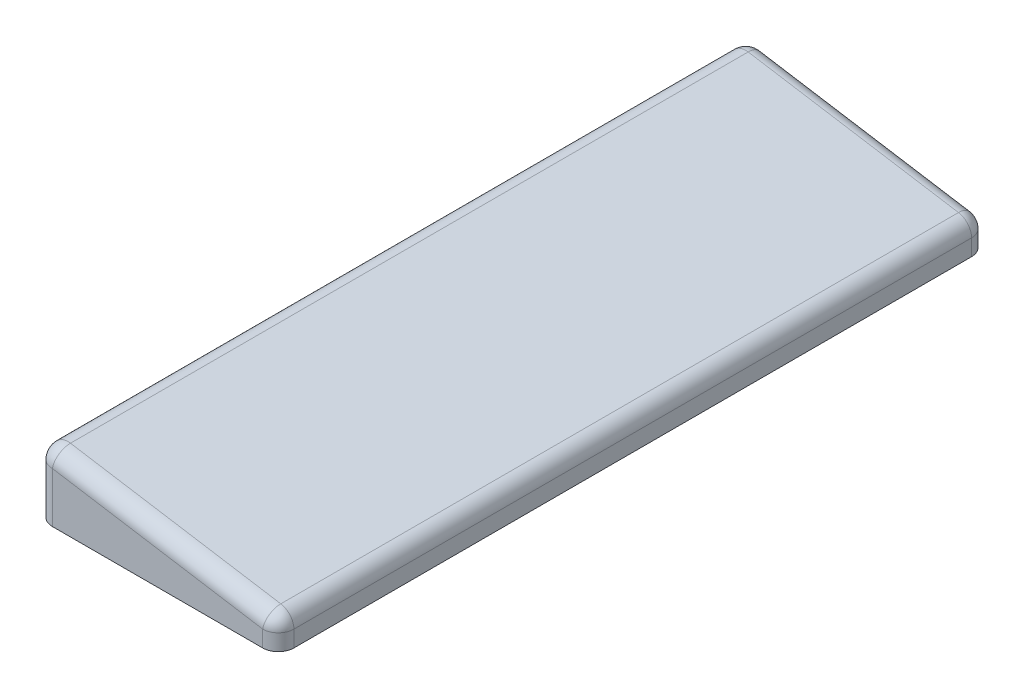
ISO-10303-21;
HEADER;
FILE_DESCRIPTION(('STEP AP214'),'2;1');
FILE_NAME('part.step','',(''),(''),'','','');
FILE_SCHEMA(('AUTOMOTIVE_DESIGN { 1 0 10303 214 1 1 1 1 }'));
ENDSEC;
DATA;
#1=APPLICATION_CONTEXT('core data for automotive mechanical design processes');
#2=APPLICATION_PROTOCOL_DEFINITION('international standard','automotive_design',2000,#1);
#3=PRODUCT_CONTEXT('',#1,'mechanical');
#4=PRODUCT('Part','Part','',(#3));
#5=PRODUCT_RELATED_PRODUCT_CATEGORY('part','',(#4));
#6=PRODUCT_DEFINITION_FORMATION('','',#4);
#7=PRODUCT_DEFINITION_CONTEXT('part definition',#1,'design');
#8=PRODUCT_DEFINITION('design','',#6,#7);
#9=PRODUCT_DEFINITION_SHAPE('','',#8);
#10=(LENGTH_UNIT() NAMED_UNIT(*) SI_UNIT(.MILLI.,.METRE.));
#11=(NAMED_UNIT(*) PLANE_ANGLE_UNIT() SI_UNIT($,.RADIAN.));
#12=(NAMED_UNIT(*) SI_UNIT($,.STERADIAN.) SOLID_ANGLE_UNIT());
#13=UNCERTAINTY_MEASURE_WITH_UNIT(LENGTH_MEASURE(1.E-05),#10,'distance_accuracy_value','');
#14=(GEOMETRIC_REPRESENTATION_CONTEXT(3) GLOBAL_UNCERTAINTY_ASSIGNED_CONTEXT((#13)) GLOBAL_UNIT_ASSIGNED_CONTEXT((#10,
#11,#12)) REPRESENTATION_CONTEXT('',''));
#15=CARTESIAN_POINT('',(0.,0.,0.));
#16=DIRECTION('',(0.,0.,1.));
#17=DIRECTION('',(1.,0.,0.));
#18=AXIS2_PLACEMENT_3D('',#15,#16,#17);
#19=CARTESIAN_POINT('',(0.,0.,-455.));
#20=DIRECTION('',(-1.,0.,0.));
#21=DIRECTION('',(0.,0.,1.));
#22=AXIS2_PLACEMENT_3D('',#19,#20,#21);
#23=PLANE('',#22);
#24=DIRECTION('',(0.,0.,1.));
#25=VECTOR('',#24,1.);
#26=CARTESIAN_POINT('',(0.,32.2578590528338,-455.));
#27=LINE('',#26,#25);
#28=CARTESIAN_POINT('',(0.,32.2578590528338,-10.));
#29=VERTEX_POINT('',#28);
#30=CARTESIAN_POINT('',(0.,32.2578590528338,-445.));
#31=VERTEX_POINT('',#30);
#32=EDGE_CURVE('E202',#29,#31,#27,.F.);
#33=ORIENTED_EDGE('',*,*,#32,.T.);
#34=DIRECTION('',(0.,-1.,0.));
#35=VECTOR('',#34,1.);
#36=CARTESIAN_POINT('',(0.,0.,-445.));
#37=LINE('',#36,#35);
#38=CARTESIAN_POINT('',(0.,0.,-445.));
#39=VERTEX_POINT('',#38);
#40=EDGE_CURVE('E180',#31,#39,#37,.T.);
#41=ORIENTED_EDGE('',*,*,#40,.T.);
#42=DIRECTION('',(0.,0.,1.));
#43=VECTOR('',#42,1.);
#44=CARTESIAN_POINT('',(0.,0.,-455.));
#45=LINE('',#44,#43);
#46=CARTESIAN_POINT('',(0.,0.,-10.0000000000001));
#47=VERTEX_POINT('',#46);
#48=EDGE_CURVE('E201',#39,#47,#45,.T.);
#49=ORIENTED_EDGE('',*,*,#48,.T.);
#50=DIRECTION('',(0.,-1.,0.));
#51=VECTOR('',#50,1.);
#52=CARTESIAN_POINT('',(0.,32.2578590528338,-10.));
#53=LINE('',#52,#51);
#54=EDGE_CURVE('E139',#47,#29,#53,.F.);
#55=ORIENTED_EDGE('',*,*,#54,.T.);
#56=EDGE_LOOP('',(#33,#41,#49,#55));
#57=FACE_BOUND('',#56,.T.);
#58=ADVANCED_FACE('F34',(#57),#23,.T.);
#59=CARTESIAN_POINT('',(0.,44.,-455.));
#60=DIRECTION('',(0.15923243882462,0.987241120712647,0.));
#61=DIRECTION('',(-0.987241120712647,0.15923243882462,0.));
#62=AXIS2_PLACEMENT_3D('',#59,#60,#61);
#63=PLANE('',#62);
#64=DIRECTION('',(0.,0.,1.));
#65=VECTOR('',#64,1.);
#66=CARTESIAN_POINT('',(146.592324388246,20.3560767115732,-455.));
#67=LINE('',#66,#65);
#68=CARTESIAN_POINT('',(146.592324388246,20.3560767115732,-10.));
#69=VERTEX_POINT('',#68);
#70=CARTESIAN_POINT('',(146.592324388246,20.3560767115732,-445.));
#71=VERTEX_POINT('',#70);
#72=EDGE_CURVE('E211',#69,#71,#67,.F.);
#73=ORIENTED_EDGE('',*,*,#72,.T.);
#74=DIRECTION('',(-0.987241120712647,0.15923243882462,0.));
#75=VECTOR('',#74,1.);
#76=CARTESIAN_POINT('',(0.,44.,-445.));
#77=LINE('',#76,#75);
#78=CARTESIAN_POINT('',(11.5923243882462,42.1302702599603,-445.));
#79=VERTEX_POINT('',#78);
#80=EDGE_CURVE('E11',#71,#79,#77,.T.);
#81=ORIENTED_EDGE('',*,*,#80,.T.);
#82=DIRECTION('',(0.,0.,1.));
#83=VECTOR('',#82,1.);
#84=CARTESIAN_POINT('',(11.5923243882462,42.1302702599603,-455.));
#85=LINE('',#84,#83);
#86=CARTESIAN_POINT('',(11.5923243882462,42.1302702599603,-10.));
#87=VERTEX_POINT('',#86);
#88=EDGE_CURVE('E213',#79,#87,#85,.T.);
#89=ORIENTED_EDGE('',*,*,#88,.T.);
#90=DIRECTION('',(-0.987241120712647,0.15923243882462,0.));
#91=VECTOR('',#90,1.);
#92=CARTESIAN_POINT('',(146.592324388246,20.3560767115732,-10.));
#93=LINE('',#92,#91);
#94=EDGE_CURVE('E154',#87,#69,#93,.F.);
#95=ORIENTED_EDGE('',*,*,#94,.T.);
#96=EDGE_LOOP('',(#73,#81,#89,#95));
#97=FACE_BOUND('',#96,.T.);
#98=ADVANCED_FACE('F232',(#97),#63,.T.);
#99=CARTESIAN_POINT('',(155.,19.,-455.));
#100=DIRECTION('',(1.,0.,0.));
#101=DIRECTION('',(0.,0.,-1.));
#102=AXIS2_PLACEMENT_3D('',#99,#100,#101);
#103=PLANE('',#102);
#104=DIRECTION('',(0.,0.,1.));
#105=VECTOR('',#104,1.);
#106=CARTESIAN_POINT('',(155.,0.,-455.));
#107=LINE('',#106,#105);
#108=CARTESIAN_POINT('',(155.,0.,-445.));
#109=VERTEX_POINT('',#108);
#110=CARTESIAN_POINT('',(155.,0.,-10.0000000000001));
#111=VERTEX_POINT('',#110);
#112=EDGE_CURVE('E204',#109,#111,#107,.T.);
#113=ORIENTED_EDGE('',*,*,#112,.F.);
#114=DIRECTION('',(0.,1.,0.));
#115=VECTOR('',#114,1.);
#116=CARTESIAN_POINT('',(155.,19.,-445.));
#117=LINE('',#116,#115);
#118=CARTESIAN_POINT('',(155.,10.4836655044467,-445.));
#119=VERTEX_POINT('',#118);
#120=EDGE_CURVE('E156',#109,#119,#117,.T.);
#121=ORIENTED_EDGE('',*,*,#120,.T.);
#122=DIRECTION('',(0.,0.,1.));
#123=VECTOR('',#122,1.);
#124=CARTESIAN_POINT('',(155.,10.4836655044467,-455.));
#125=LINE('',#124,#123);
#126=CARTESIAN_POINT('',(155.,10.4836655044467,-10.));
#127=VERTEX_POINT('',#126);
#128=EDGE_CURVE('E206',#119,#127,#125,.T.);
#129=ORIENTED_EDGE('',*,*,#128,.T.);
#130=DIRECTION('',(0.,1.,0.));
#131=VECTOR('',#130,1.);
#132=CARTESIAN_POINT('',(155.,0.,-10.));
#133=LINE('',#132,#131);
#134=EDGE_CURVE('E140',#127,#111,#133,.F.);
#135=ORIENTED_EDGE('',*,*,#134,.T.);
#136=EDGE_LOOP('',(#113,#121,#129,#135));
#137=FACE_BOUND('',#136,.T.);
#138=ADVANCED_FACE('F245',(#137),#103,.T.);
#139=CARTESIAN_POINT('',(0.,0.,-455.));
#140=DIRECTION('',(0.,-1.,0.));
#141=DIRECTION('',(0.,0.,-1.));
#142=AXIS2_PLACEMENT_3D('',#139,#140,#141);
#143=PLANE('',#142);
#144=DIRECTION('',(1.,0.,0.));
#145=VECTOR('',#144,1.);
#146=CARTESIAN_POINT('',(0.,0.,-455.));
#147=LINE('',#146,#145);
#148=CARTESIAN_POINT('',(10.,0.,-455.));
#149=VERTEX_POINT('',#148);
#150=CARTESIAN_POINT('',(145.,0.,-455.));
#151=VERTEX_POINT('',#150);
#152=EDGE_CURVE('E135',#149,#151,#147,.T.);
#153=ORIENTED_EDGE('',*,*,#152,.T.);
#154=CARTESIAN_POINT('',(145.,0.,-445.));
#155=DIRECTION('',(0.,-1.,0.));
#156=DIRECTION('',(0.,0.,-1.));
#157=AXIS2_PLACEMENT_3D('',#154,#155,#156);
#158=CIRCLE('',#157,10.);
#159=EDGE_CURVE('E176',#151,#109,#158,.T.);
#160=ORIENTED_EDGE('',*,*,#159,.T.);
#161=ORIENTED_EDGE('',*,*,#112,.T.);
#162=CARTESIAN_POINT('',(145.,0.,-10.));
#163=DIRECTION('',(0.,-1.,0.));
#164=DIRECTION('',(0.,0.,-1.));
#165=AXIS2_PLACEMENT_3D('',#162,#163,#164);
#166=CIRCLE('',#165,10.);
#167=CARTESIAN_POINT('',(145.,0.,0.));
#168=VERTEX_POINT('',#167);
#169=EDGE_CURVE('E134',#111,#168,#166,.T.);
#170=ORIENTED_EDGE('',*,*,#169,.T.);
#171=DIRECTION('',(1.,0.,0.));
#172=VECTOR('',#171,1.);
#173=CARTESIAN_POINT('',(0.,0.,0.));
#174=LINE('',#173,#172);
#175=CARTESIAN_POINT('',(10.,0.,0.));
#176=VERTEX_POINT('',#175);
#177=EDGE_CURVE('E116',#176,#168,#174,.T.);
#178=ORIENTED_EDGE('',*,*,#177,.F.);
#179=CARTESIAN_POINT('',(10.,0.,-10.));
#180=DIRECTION('',(0.,-1.,0.));
#181=DIRECTION('',(0.,0.,-1.));
#182=AXIS2_PLACEMENT_3D('',#179,#180,#181);
#183=CIRCLE('',#182,10.);
#184=EDGE_CURVE('E131',#176,#47,#183,.T.);
#185=ORIENTED_EDGE('',*,*,#184,.T.);
#186=ORIENTED_EDGE('',*,*,#48,.F.);
#187=CARTESIAN_POINT('',(10.,0.,-445.));
#188=DIRECTION('',(0.,-1.,0.));
#189=DIRECTION('',(0.,0.,-1.));
#190=AXIS2_PLACEMENT_3D('',#187,#188,#189);
#191=CIRCLE('',#190,10.);
#192=EDGE_CURVE('E174',#39,#149,#191,.T.);
#193=ORIENTED_EDGE('',*,*,#192,.T.);
#194=EDGE_LOOP('',(#153,#160,#161,#170,#178,#185,#186,#193));
#195=FACE_BOUND('',#194,.T.);
#196=ADVANCED_FACE('F129',(#195),#143,.T.);
#197=CARTESIAN_POINT('',(0.,0.,-455.));
#198=DIRECTION('',(0.,0.,-1.));
#199=DIRECTION('',(-1.,0.,0.));
#200=AXIS2_PLACEMENT_3D('',#197,#198,#199);
#201=PLANE('',#200);
#202=DIRECTION('',(-0.987241120712647,0.15923243882462,0.));
#203=VECTOR('',#202,1.);
#204=CARTESIAN_POINT('',(5.32451131155095,33.0119701316159,-455.));
#205=LINE('',#204,#203);
#206=CARTESIAN_POINT('',(10.,32.2578590528338,-455.));
#207=VERTEX_POINT('',#206);
#208=CARTESIAN_POINT('',(145.,10.4836655044467,-455.));
#209=VERTEX_POINT('',#208);
#210=EDGE_CURVE('E168',#207,#209,#205,.F.);
#211=ORIENTED_EDGE('',*,*,#210,.T.);
#212=DIRECTION('',(0.,1.,0.));
#213=VECTOR('',#212,1.);
#214=CARTESIAN_POINT('',(145.,0.,-455.));
#215=LINE('',#214,#213);
#216=EDGE_CURVE('E172',#209,#151,#215,.F.);
#217=ORIENTED_EDGE('',*,*,#216,.T.);
#218=ORIENTED_EDGE('',*,*,#152,.F.);
#219=DIRECTION('',(0.,-1.,0.));
#220=VECTOR('',#219,1.);
#221=CARTESIAN_POINT('',(10.,0.,-455.));
#222=LINE('',#221,#220);
#223=EDGE_CURVE('E170',#149,#207,#222,.F.);
#224=ORIENTED_EDGE('',*,*,#223,.T.);
#225=EDGE_LOOP('',(#211,#217,#218,#224));
#226=FACE_BOUND('',#225,.T.);
#227=ADVANCED_FACE('F251',(#226),#201,.T.);
#228=CARTESIAN_POINT('',(0.,0.,0.));
#229=DIRECTION('',(0.,0.,-1.));
#230=DIRECTION('',(-1.,0.,0.));
#231=AXIS2_PLACEMENT_3D('',#228,#229,#230);
#232=PLANE('',#231);
#233=ORIENTED_EDGE('',*,*,#177,.T.);
#234=DIRECTION('',(0.,1.,0.));
#235=VECTOR('',#234,1.);
#236=CARTESIAN_POINT('',(145.,10.4836655044467,0.));
#237=LINE('',#236,#235);
#238=CARTESIAN_POINT('',(145.,10.4836655044467,0.));
#239=VERTEX_POINT('',#238);
#240=EDGE_CURVE('E124',#168,#239,#237,.T.);
#241=ORIENTED_EDGE('',*,*,#240,.T.);
#242=DIRECTION('',(-0.987241120712647,0.15923243882462,0.));
#243=VECTOR('',#242,1.);
#244=CARTESIAN_POINT('',(10.,32.2578590528338,0.));
#245=LINE('',#244,#243);
#246=CARTESIAN_POINT('',(10.,32.2578590528338,0.));
#247=VERTEX_POINT('',#246);
#248=EDGE_CURVE('E119',#239,#247,#245,.T.);
#249=ORIENTED_EDGE('',*,*,#248,.T.);
#250=DIRECTION('',(0.,-1.,0.));
#251=VECTOR('',#250,1.);
#252=CARTESIAN_POINT('',(10.,0.,0.));
#253=LINE('',#252,#251);
#254=EDGE_CURVE('E112',#247,#176,#253,.T.);
#255=ORIENTED_EDGE('',*,*,#254,.T.);
#256=EDGE_LOOP('',(#233,#241,#249,#255));
#257=FACE_BOUND('',#256,.T.);
#258=ADVANCED_FACE('F114',(#257),#232,.F.);
#259=CARTESIAN_POINT('',(145.,10.4836655044467,-455.));
#260=DIRECTION('',(0.,0.,1.));
#261=DIRECTION('',(1.,0.,0.));
#262=AXIS2_PLACEMENT_3D('',#259,#260,#261);
#263=CYLINDRICAL_SURFACE('',#262,10.);
#264=ORIENTED_EDGE('',*,*,#128,.F.);
#265=CARTESIAN_POINT('',(145.,10.4836655044467,-445.));
#266=DIRECTION('',(0.,0.,1.));
#267=DIRECTION('',(1.,0.,0.));
#268=AXIS2_PLACEMENT_3D('',#265,#266,#267);
#269=CIRCLE('',#268,10.);
#270=EDGE_CURVE('E178',#119,#71,#269,.T.);
#271=ORIENTED_EDGE('',*,*,#270,.T.);
#272=ORIENTED_EDGE('',*,*,#72,.F.);
#273=CARTESIAN_POINT('',(145.,10.4836655044467,-10.));
#274=DIRECTION('',(0.,0.,1.));
#275=DIRECTION('',(1.,0.,0.));
#276=AXIS2_PLACEMENT_3D('',#273,#274,#275);
#277=CIRCLE('',#276,10.);
#278=EDGE_CURVE('E142',#69,#127,#277,.F.);
#279=ORIENTED_EDGE('',*,*,#278,.T.);
#280=EDGE_LOOP('',(#264,#271,#272,#279));
#281=FACE_BOUND('',#280,.T.);
#282=ADVANCED_FACE('F236',(#281),#263,.T.);
#283=CARTESIAN_POINT('',(10.,32.2578590528338,-455.));
#284=DIRECTION('',(0.,0.,1.));
#285=DIRECTION('',(1.,0.,0.));
#286=AXIS2_PLACEMENT_3D('',#283,#284,#285);
#287=CYLINDRICAL_SURFACE('',#286,10.);
#288=ORIENTED_EDGE('',*,*,#88,.F.);
#289=CARTESIAN_POINT('',(10.,32.2578590528338,-445.));
#290=DIRECTION('',(0.,0.,1.));
#291=DIRECTION('',(1.,0.,0.));
#292=AXIS2_PLACEMENT_3D('',#289,#290,#291);
#293=CIRCLE('',#292,10.);
#294=EDGE_CURVE('E43',#79,#31,#293,.T.);
#295=ORIENTED_EDGE('',*,*,#294,.T.);
#296=ORIENTED_EDGE('',*,*,#32,.F.);
#297=CARTESIAN_POINT('',(10.,32.2578590528338,-10.));
#298=DIRECTION('',(0.,0.,1.));
#299=DIRECTION('',(1.,0.,0.));
#300=AXIS2_PLACEMENT_3D('',#297,#298,#299);
#301=CIRCLE('',#300,10.);
#302=EDGE_CURVE('E151',#29,#87,#301,.F.);
#303=ORIENTED_EDGE('',*,*,#302,.T.);
#304=EDGE_LOOP('',(#288,#295,#296,#303));
#305=FACE_BOUND('',#304,.T.);
#306=ADVANCED_FACE('F231',(#305),#287,.T.);
#307=CARTESIAN_POINT('',(10.,0.,-10.));
#308=DIRECTION('',(0.,1.,0.));
#309=DIRECTION('',(0.,0.,1.));
#310=AXIS2_PLACEMENT_3D('',#307,#308,#309);
#311=CYLINDRICAL_SURFACE('',#310,10.);
#312=CARTESIAN_POINT('',(10.,32.2578590528338,-10.));
#313=DIRECTION('',(0.,1.,0.));
#314=DIRECTION('',(0.,0.,1.));
#315=AXIS2_PLACEMENT_3D('',#312,#313,#314);
#316=CIRCLE('',#315,10.);
#317=EDGE_CURVE('E136',#29,#247,#316,.T.);
#318=ORIENTED_EDGE('',*,*,#317,.F.);
#319=ORIENTED_EDGE('',*,*,#54,.F.);
#320=ORIENTED_EDGE('',*,*,#184,.F.);
#321=ORIENTED_EDGE('',*,*,#254,.F.);
#322=EDGE_LOOP('',(#318,#319,#320,#321));
#323=FACE_BOUND('',#322,.T.);
#324=ADVANCED_FACE('F138',(#323),#311,.T.);
#325=CARTESIAN_POINT('',(10.,32.2578590528338,-10.));
#326=DIRECTION('',(0.,0.,1.));
#327=DIRECTION('',(1.,0.,0.));
#328=AXIS2_PLACEMENT_3D('',#325,#326,#327);
#329=SPHERICAL_SURFACE('',#328,10.);
#330=ORIENTED_EDGE('',*,*,#302,.F.);
#331=ORIENTED_EDGE('',*,*,#317,.T.);
#332=CARTESIAN_POINT('',(10.,32.2578590528338,-10.));
#333=DIRECTION('',(0.987241120712647,-0.159232438824621,0.));
#334=DIRECTION('',(0.15923243882462,0.987241120712647,0.));
#335=AXIS2_PLACEMENT_3D('',#332,#333,#334);
#336=CIRCLE('',#335,10.);
#337=EDGE_CURVE('E162',#87,#247,#336,.T.);
#338=ORIENTED_EDGE('',*,*,#337,.F.);
#339=EDGE_LOOP('',(#330,#331,#338));
#340=FACE_BOUND('',#339,.T.);
#341=ADVANCED_FACE('F230',(#340),#329,.T.);
#342=CARTESIAN_POINT('',(5.32451131155095,33.0119701316159,-10.));
#343=DIRECTION('',(0.987241120712647,-0.15923243882462,0.));
#344=DIRECTION('',(0.15923243882462,0.987241120712647,0.));
#345=AXIS2_PLACEMENT_3D('',#342,#343,#344);
#346=CYLINDRICAL_SURFACE('',#345,10.);
#347=CARTESIAN_POINT('',(145.,10.4836655044467,-10.));
#348=DIRECTION('',(0.987241120712647,-0.159232438824619,0.));
#349=DIRECTION('',(0.159232438824619,0.987241120712647,0.));
#350=AXIS2_PLACEMENT_3D('',#347,#348,#349);
#351=CIRCLE('',#350,10.);
#352=EDGE_CURVE('E159',#69,#239,#351,.T.);
#353=ORIENTED_EDGE('',*,*,#352,.F.);
#354=ORIENTED_EDGE('',*,*,#94,.F.);
#355=ORIENTED_EDGE('',*,*,#337,.T.);
#356=ORIENTED_EDGE('',*,*,#248,.F.);
#357=EDGE_LOOP('',(#353,#354,#355,#356));
#358=FACE_BOUND('',#357,.T.);
#359=ADVANCED_FACE('F226',(#358),#346,.T.);
#360=CARTESIAN_POINT('',(145.,10.4836655044467,-10.));
#361=DIRECTION('',(0.,0.,1.));
#362=DIRECTION('',(1.,0.,0.));
#363=AXIS2_PLACEMENT_3D('',#360,#361,#362);
#364=SPHERICAL_SURFACE('',#363,10.);
#365=ORIENTED_EDGE('',*,*,#278,.F.);
#366=ORIENTED_EDGE('',*,*,#352,.T.);
#367=CARTESIAN_POINT('',(145.,10.4836655044467,-10.));
#368=DIRECTION('',(0.,-1.,0.));
#369=DIRECTION('',(0.,0.,-1.));
#370=AXIS2_PLACEMENT_3D('',#367,#368,#369);
#371=CIRCLE('',#370,10.);
#372=EDGE_CURVE('E157',#127,#239,#371,.T.);
#373=ORIENTED_EDGE('',*,*,#372,.F.);
#374=EDGE_LOOP('',(#365,#366,#373));
#375=FACE_BOUND('',#374,.T.);
#376=ADVANCED_FACE('F223',(#375),#364,.T.);
#377=CARTESIAN_POINT('',(145.,0.,-10.));
#378=DIRECTION('',(0.,-1.,0.));
#379=DIRECTION('',(0.,0.,-1.));
#380=AXIS2_PLACEMENT_3D('',#377,#378,#379);
#381=CYLINDRICAL_SURFACE('',#380,10.);
#382=ORIENTED_EDGE('',*,*,#169,.F.);
#383=ORIENTED_EDGE('',*,*,#134,.F.);
#384=ORIENTED_EDGE('',*,*,#372,.T.);
#385=ORIENTED_EDGE('',*,*,#240,.F.);
#386=EDGE_LOOP('',(#382,#383,#384,#385));
#387=FACE_BOUND('',#386,.T.);
#388=ADVANCED_FACE('F217',(#387),#381,.T.);
#389=CARTESIAN_POINT('',(10.,0.,-445.));
#390=DIRECTION('',(0.,-1.,0.));
#391=DIRECTION('',(0.,0.,-1.));
#392=AXIS2_PLACEMENT_3D('',#389,#390,#391);
#393=CYLINDRICAL_SURFACE('',#392,10.);
#394=ORIENTED_EDGE('',*,*,#192,.F.);
#395=ORIENTED_EDGE('',*,*,#40,.F.);
#396=CARTESIAN_POINT('',(10.,32.2578590528338,-445.));
#397=DIRECTION('',(0.,1.,0.));
#398=DIRECTION('',(0.,0.,1.));
#399=AXIS2_PLACEMENT_3D('',#396,#397,#398);
#400=CIRCLE('',#399,10.);
#401=EDGE_CURVE('E38',#207,#31,#400,.T.);
#402=ORIENTED_EDGE('',*,*,#401,.F.);
#403=ORIENTED_EDGE('',*,*,#223,.F.);
#404=EDGE_LOOP('',(#394,#395,#402,#403));
#405=FACE_BOUND('',#404,.T.);
#406=ADVANCED_FACE('F36',(#405),#393,.T.);
#407=CARTESIAN_POINT('',(10.,32.2578590528338,-445.));
#408=DIRECTION('',(0.,0.,1.));
#409=DIRECTION('',(1.,0.,0.));
#410=AXIS2_PLACEMENT_3D('',#407,#408,#409);
#411=SPHERICAL_SURFACE('',#410,10.);
#412=ORIENTED_EDGE('',*,*,#401,.T.);
#413=ORIENTED_EDGE('',*,*,#294,.F.);
#414=CARTESIAN_POINT('',(10.,32.2578590528338,-445.));
#415=DIRECTION('',(0.987241120712647,-0.15923243882462,0.));
#416=DIRECTION('',(0.15923243882462,0.987241120712647,0.));
#417=AXIS2_PLACEMENT_3D('',#414,#415,#416);
#418=CIRCLE('',#417,10.);
#419=EDGE_CURVE('E187',#207,#79,#418,.T.);
#420=ORIENTED_EDGE('',*,*,#419,.F.);
#421=EDGE_LOOP('',(#412,#413,#420));
#422=FACE_BOUND('',#421,.T.);
#423=ADVANCED_FACE('F195',(#422),#411,.T.);
#424=CARTESIAN_POINT('',(-1.59232438824621,34.1275887928735,-445.));
#425=DIRECTION('',(-0.987241120712647,0.15923243882462,0.));
#426=DIRECTION('',(-0.15923243882462,-0.987241120712647,0.));
#427=AXIS2_PLACEMENT_3D('',#424,#425,#426);
#428=CYLINDRICAL_SURFACE('',#427,10.);
#429=ORIENTED_EDGE('',*,*,#419,.T.);
#430=ORIENTED_EDGE('',*,*,#80,.F.);
#431=CARTESIAN_POINT('',(145.,10.4836655044467,-445.));
#432=DIRECTION('',(0.987241120712647,-0.159232438824622,0.));
#433=DIRECTION('',(0.159232438824622,0.987241120712647,0.));
#434=AXIS2_PLACEMENT_3D('',#431,#432,#433);
#435=CIRCLE('',#434,10.);
#436=EDGE_CURVE('E185',#209,#71,#435,.T.);
#437=ORIENTED_EDGE('',*,*,#436,.F.);
#438=ORIENTED_EDGE('',*,*,#210,.F.);
#439=EDGE_LOOP('',(#429,#430,#437,#438));
#440=FACE_BOUND('',#439,.T.);
#441=ADVANCED_FACE('F252',(#440),#428,.T.);
#442=CARTESIAN_POINT('',(145.,10.4836655044467,-445.));
#443=DIRECTION('',(0.,0.,1.));
#444=DIRECTION('',(1.,0.,0.));
#445=AXIS2_PLACEMENT_3D('',#442,#443,#444);
#446=SPHERICAL_SURFACE('',#445,10.);
#447=ORIENTED_EDGE('',*,*,#436,.T.);
#448=ORIENTED_EDGE('',*,*,#270,.F.);
#449=CARTESIAN_POINT('',(145.,10.4836655044467,-445.));
#450=DIRECTION('',(0.,-1.,0.));
#451=DIRECTION('',(0.,0.,-1.));
#452=AXIS2_PLACEMENT_3D('',#449,#450,#451);
#453=CIRCLE('',#452,10.);
#454=EDGE_CURVE('E183',#209,#119,#453,.T.);
#455=ORIENTED_EDGE('',*,*,#454,.F.);
#456=EDGE_LOOP('',(#447,#448,#455));
#457=FACE_BOUND('',#456,.T.);
#458=ADVANCED_FACE('F240',(#457),#446,.T.);
#459=CARTESIAN_POINT('',(145.,19.,-445.));
#460=DIRECTION('',(0.,1.,0.));
#461=DIRECTION('',(0.,0.,1.));
#462=AXIS2_PLACEMENT_3D('',#459,#460,#461);
#463=CYLINDRICAL_SURFACE('',#462,10.);
#464=ORIENTED_EDGE('',*,*,#159,.F.);
#465=ORIENTED_EDGE('',*,*,#216,.F.);
#466=ORIENTED_EDGE('',*,*,#454,.T.);
#467=ORIENTED_EDGE('',*,*,#120,.F.);
#468=EDGE_LOOP('',(#464,#465,#466,#467));
#469=FACE_BOUND('',#468,.T.);
#470=ADVANCED_FACE('F248',(#469),#463,.T.);
#471=CLOSED_SHELL('',(#58,#98,#138,#196,#227,#258,#282,#306,#324,#341,#359,#376,#388,#406,#423,
#441,#458,#470));
#472=MANIFOLD_SOLID_BREP('B2',#471);
#473=ADVANCED_BREP_SHAPE_REPRESENTATION('',(#18,#472),#14);
#474=SHAPE_DEFINITION_REPRESENTATION(#9,#473);
ENDSEC;
END-ISO-10303-21;
